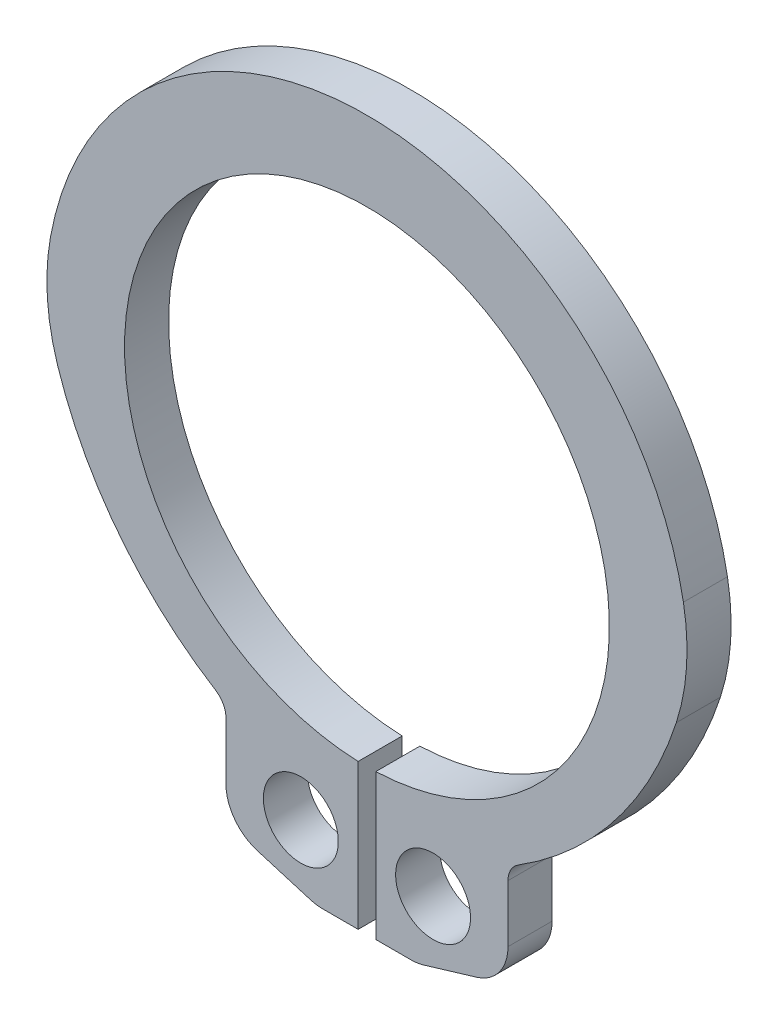
ISO-10303-21;
HEADER;
FILE_DESCRIPTION(('STEP AP214'),'2;1');
FILE_NAME('part.step','',(''),(''),'','','');
FILE_SCHEMA(('AUTOMOTIVE_DESIGN { 1 0 10303 214 1 1 1 1 }'));
ENDSEC;
DATA;
#1=APPLICATION_CONTEXT('core data for automotive mechanical design processes');
#2=APPLICATION_PROTOCOL_DEFINITION('international standard','automotive_design',2000,#1);
#3=PRODUCT_CONTEXT('',#1,'mechanical');
#4=PRODUCT('Part','Part','',(#3));
#5=PRODUCT_RELATED_PRODUCT_CATEGORY('part','',(#4));
#6=PRODUCT_DEFINITION_FORMATION('','',#4);
#7=PRODUCT_DEFINITION_CONTEXT('part definition',#1,'design');
#8=PRODUCT_DEFINITION('design','',#6,#7);
#9=PRODUCT_DEFINITION_SHAPE('','',#8);
#10=(LENGTH_UNIT() NAMED_UNIT(*) SI_UNIT(.MILLI.,.METRE.));
#11=(NAMED_UNIT(*) PLANE_ANGLE_UNIT() SI_UNIT($,.RADIAN.));
#12=(NAMED_UNIT(*) SI_UNIT($,.STERADIAN.) SOLID_ANGLE_UNIT());
#13=UNCERTAINTY_MEASURE_WITH_UNIT(LENGTH_MEASURE(1.E-05),#10,'distance_accuracy_value','');
#14=(GEOMETRIC_REPRESENTATION_CONTEXT(3) GLOBAL_UNCERTAINTY_ASSIGNED_CONTEXT((#13)) GLOBAL_UNIT_ASSIGNED_CONTEXT((#10,
#11,#12)) REPRESENTATION_CONTEXT('',''));
#15=CARTESIAN_POINT('',(0.,0.,0.));
#16=DIRECTION('',(0.,0.,1.));
#17=DIRECTION('',(1.,0.,0.));
#18=AXIS2_PLACEMENT_3D('',#15,#16,#17);
#19=CARTESIAN_POINT('',(2.26199310946051,0.416397853924444,0.499999999999945));
#20=DIRECTION('',(0.,0.,-0.999999999999981));
#21=DIRECTION('',(-1.,0.,0.));
#22=AXIS2_PLACEMENT_3D('',#19,#20,#21);
#23=CYLINDRICAL_SURFACE('',#22,5.);
#24=CARTESIAN_POINT('',(2.26199310946007,0.41639785392622,-0.499999999999945));
#25=DIRECTION('',(0.,0.,-0.999999999999981));
#26=DIRECTION('',(-1.,0.,0.));
#27=AXIS2_PLACEMENT_3D('',#24,#25,#26);
#28=CIRCLE('',#27,5.);
#29=CARTESIAN_POINT('',(7.17936943437547,1.32161057984792,-0.499999999999945));
#30=VERTEX_POINT('',#29);
#31=CARTESIAN_POINT('',(7.01817403919958,-1.12591954647812,-0.499999999999945));
#32=VERTEX_POINT('',#31);
#33=EDGE_CURVE('E208',#30,#32,#28,.T.);
#34=ORIENTED_EDGE('',*,*,#33,.F.);
#35=DIRECTION('',(0.,0.,-0.999999999999981));
#36=VECTOR('',#35,1.);
#37=CARTESIAN_POINT('',(7.17936943437536,1.32161057984836,0.499999999999945));
#38=LINE('',#37,#36);
#39=CARTESIAN_POINT('',(7.17936943437536,1.32161057984836,0.499999999999945));
#40=VERTEX_POINT('',#39);
#41=EDGE_CURVE('E11',#40,#30,#38,.T.);
#42=ORIENTED_EDGE('',*,*,#41,.F.);
#43=CARTESIAN_POINT('',(2.26199310946051,0.416397853924444,0.499999999999945));
#44=DIRECTION('',(0.,0.,-0.999999999999981));
#45=DIRECTION('',(-1.,0.,0.));
#46=AXIS2_PLACEMENT_3D('',#43,#44,#45);
#47=CIRCLE('',#46,5.);
#48=CARTESIAN_POINT('',(7.01817403919958,-1.12591954647812,0.499999999999945));
#49=VERTEX_POINT('',#48);
#50=EDGE_CURVE('E264',#40,#49,#47,.T.);
#51=ORIENTED_EDGE('',*,*,#50,.T.);
#52=DIRECTION('',(0.,0.,-0.999999999999981));
#53=VECTOR('',#52,1.);
#54=CARTESIAN_POINT('',(7.01817403919958,-1.12591954647812,0.499999999999945));
#55=LINE('',#54,#53);
#56=EDGE_CURVE('E45',#49,#32,#55,.T.);
#57=ORIENTED_EDGE('',*,*,#56,.T.);
#58=EDGE_LOOP('',(#34,#42,#51,#57));
#59=FACE_BOUND('',#58,.T.);
#60=ADVANCED_FACE('F39',(#59),#23,.T.);
#61=CARTESIAN_POINT('',(0.,0.,0.499999999999945));
#62=DIRECTION('',(0.,0.,-0.999999999999981));
#63=DIRECTION('',(-1.,0.,0.));
#64=AXIS2_PLACEMENT_3D('',#61,#62,#63);
#65=CYLINDRICAL_SURFACE('',#64,7.29999999999999);
#66=CARTESIAN_POINT('',(0.,0.,-0.499999999999945));
#67=DIRECTION('',(0.,0.,-0.999999999999981));
#68=DIRECTION('',(-1.,0.,0.));
#69=AXIS2_PLACEMENT_3D('',#66,#67,#68);
#70=CIRCLE('',#69,7.29999999999999);
#71=CARTESIAN_POINT('',(-7.17936943437492,1.32161057984792,-0.499999999999945));
#72=VERTEX_POINT('',#71);
#73=EDGE_CURVE('E263',#72,#30,#70,.T.);
#74=ORIENTED_EDGE('',*,*,#73,.F.);
#75=DIRECTION('',(0.,0.,-0.999999999999981));
#76=VECTOR('',#75,1.);
#77=CARTESIAN_POINT('',(-7.1793694343748,1.32161057984836,0.499999999999945));
#78=LINE('',#77,#76);
#79=CARTESIAN_POINT('',(-7.1793694343748,1.32161057984836,0.499999999999945));
#80=VERTEX_POINT('',#79);
#81=EDGE_CURVE('E48',#80,#72,#78,.T.);
#82=ORIENTED_EDGE('',*,*,#81,.F.);
#83=CARTESIAN_POINT('',(0.,0.,0.499999999999945));
#84=DIRECTION('',(0.,0.,-0.999999999999981));
#85=DIRECTION('',(-1.,0.,0.));
#86=AXIS2_PLACEMENT_3D('',#83,#84,#85);
#87=CIRCLE('',#86,7.29999999999999);
#88=EDGE_CURVE('E196',#80,#40,#87,.T.);
#89=ORIENTED_EDGE('',*,*,#88,.T.);
#90=ORIENTED_EDGE('',*,*,#41,.T.);
#91=EDGE_LOOP('',(#74,#82,#89,#90));
#92=FACE_BOUND('',#91,.T.);
#93=ADVANCED_FACE('F301',(#92),#65,.T.);
#94=CARTESIAN_POINT('',(-2.26199310946074,0.416397853924888,0.499999999999945));
#95=DIRECTION('',(0.,0.,-0.999999999999981));
#96=DIRECTION('',(-1.,0.,0.));
#97=AXIS2_PLACEMENT_3D('',#94,#95,#96);
#98=CYLINDRICAL_SURFACE('',#97,5.);
#99=CARTESIAN_POINT('',(-2.26199310946074,0.416397853924888,-0.499999999999945));
#100=DIRECTION('',(0.,0.,-0.999999999999981));
#101=DIRECTION('',(-1.,0.,0.));
#102=AXIS2_PLACEMENT_3D('',#99,#100,#101);
#103=CIRCLE('',#102,5.);
#104=CARTESIAN_POINT('',(-7.01817403919958,-1.12591954647812,-0.499999999999945));
#105=VERTEX_POINT('',#104);
#106=EDGE_CURVE('E183',#105,#72,#103,.T.);
#107=ORIENTED_EDGE('',*,*,#106,.F.);
#108=DIRECTION('',(0.,0.,-0.999999999999981));
#109=VECTOR('',#108,1.);
#110=CARTESIAN_POINT('',(-7.01817403920013,-1.12591954647812,0.499999999999945));
#111=LINE('',#110,#109);
#112=CARTESIAN_POINT('',(-7.01817403920013,-1.12591954647812,0.499999999999945));
#113=VERTEX_POINT('',#112);
#114=EDGE_CURVE('E180',#113,#105,#111,.T.);
#115=ORIENTED_EDGE('',*,*,#114,.F.);
#116=CARTESIAN_POINT('',(-2.26199310946074,0.416397853924888,0.499999999999945));
#117=DIRECTION('',(0.,0.,-0.999999999999981));
#118=DIRECTION('',(-1.,0.,0.));
#119=AXIS2_PLACEMENT_3D('',#116,#117,#118);
#120=CIRCLE('',#119,5.);
#121=EDGE_CURVE('E181',#113,#80,#120,.T.);
#122=ORIENTED_EDGE('',*,*,#121,.T.);
#123=ORIENTED_EDGE('',*,*,#81,.T.);
#124=EDGE_LOOP('',(#107,#115,#122,#123));
#125=FACE_BOUND('',#124,.T.);
#126=ADVANCED_FACE('F185',(#125),#98,.T.);
#127=CARTESIAN_POINT('',(1.06941400291882,1.4966946788677,0.499999999999945));
#128=DIRECTION('',(0.,0.,-0.999999999999981));
#129=DIRECTION('',(-1.,0.,0.));
#130=AXIS2_PLACEMENT_3D('',#127,#128,#129);
#131=CYLINDRICAL_SURFACE('',#130,8.50218711356155);
#132=CARTESIAN_POINT('',(1.06941400291882,1.4966946788677,-0.499999999999945));
#133=DIRECTION('',(0.,0.,-0.999999999999981));
#134=DIRECTION('',(-1.,0.,0.));
#135=AXIS2_PLACEMENT_3D('',#132,#133,#134);
#136=CIRCLE('',#135,8.50218711356155);
#137=CARTESIAN_POINT('',(-3.43509693018251,-5.71416983016171,-0.499999999999945));
#138=VERTEX_POINT('',#137);
#139=EDGE_CURVE('E257',#138,#105,#136,.T.);
#140=ORIENTED_EDGE('',*,*,#139,.F.);
#141=DIRECTION('',(0.,0.,-0.999999999999981));
#142=VECTOR('',#141,1.);
#143=CARTESIAN_POINT('',(-3.43509693018251,-5.71416983016171,0.499999999999945));
#144=LINE('',#143,#142);
#145=CARTESIAN_POINT('',(-3.43509693018251,-5.71416983016171,0.499999999999945));
#146=VERTEX_POINT('',#145);
#147=EDGE_CURVE('E188',#146,#138,#144,.T.);
#148=ORIENTED_EDGE('',*,*,#147,.F.);
#149=CARTESIAN_POINT('',(1.06941400291882,1.4966946788677,0.499999999999945));
#150=DIRECTION('',(0.,0.,-0.999999999999981));
#151=DIRECTION('',(-1.,0.,0.));
#152=AXIS2_PLACEMENT_3D('',#149,#150,#151);
#153=CIRCLE('',#152,8.50218711356155);
#154=EDGE_CURVE('E198',#146,#113,#153,.T.);
#155=ORIENTED_EDGE('',*,*,#154,.T.);
#156=ORIENTED_EDGE('',*,*,#114,.T.);
#157=EDGE_LOOP('',(#140,#148,#155,#156));
#158=FACE_BOUND('',#157,.T.);
#159=ADVANCED_FACE('F199',(#158),#131,.T.);
#160=CARTESIAN_POINT('',(-3.70000000000004,-6.13822921704177,0.499999999999945));
#161=DIRECTION('',(0.,0.,-0.999999999999981));
#162=DIRECTION('',(-1.,0.,0.));
#163=AXIS2_PLACEMENT_3D('',#160,#161,#162);
#164=CYLINDRICAL_SURFACE('',#163,0.499999999999999);
#165=CARTESIAN_POINT('',(-3.70000000000004,-6.13822921704177,-0.499999999999945));
#166=DIRECTION('',(0.,0.,0.999999999999981));
#167=DIRECTION('',(1.,0.,0.));
#168=AXIS2_PLACEMENT_3D('',#165,#166,#167);
#169=CIRCLE('',#168,0.499999999999999);
#170=CARTESIAN_POINT('',(-3.20000000000065,-6.13822921704266,-0.499999999999945));
#171=VERTEX_POINT('',#170);
#172=EDGE_CURVE('E260',#171,#138,#169,.T.);
#173=ORIENTED_EDGE('',*,*,#172,.F.);
#174=DIRECTION('',(0.,0.,-0.999999999999981));
#175=VECTOR('',#174,1.);
#176=CARTESIAN_POINT('',(-3.20000000000065,-6.13822921704266,0.499999999999945));
#177=LINE('',#176,#175);
#178=CARTESIAN_POINT('',(-3.20000000000065,-6.13822921704266,0.499999999999945));
#179=VERTEX_POINT('',#178);
#180=EDGE_CURVE('E267',#179,#171,#177,.T.);
#181=ORIENTED_EDGE('',*,*,#180,.F.);
#182=CARTESIAN_POINT('',(-3.70000000000004,-6.13822921704177,0.499999999999945));
#183=DIRECTION('',(0.,0.,0.999999999999981));
#184=DIRECTION('',(1.,0.,0.));
#185=AXIS2_PLACEMENT_3D('',#182,#183,#184);
#186=CIRCLE('',#185,0.499999999999999);
#187=EDGE_CURVE('E203',#179,#146,#186,.T.);
#188=ORIENTED_EDGE('',*,*,#187,.T.);
#189=ORIENTED_EDGE('',*,*,#147,.T.);
#190=EDGE_LOOP('',(#173,#181,#188,#189));
#191=FACE_BOUND('',#190,.T.);
#192=ADVANCED_FACE('F314',(#191),#164,.F.);
#193=CARTESIAN_POINT('',(-3.2000000000002,-7.43585997502594,0.499999999999945));
#194=DIRECTION('',(-1.,0.,0.));
#195=DIRECTION('',(0.,0.,0.999999999999981));
#196=AXIS2_PLACEMENT_3D('',#193,#194,#195);
#197=PLANE('',#196);
#198=DIRECTION('',(0.,0.999999999999995,0.));
#199=VECTOR('',#198,1.);
#200=CARTESIAN_POINT('',(-3.19999999999965,-7.43585997502461,-0.499999999999945));
#201=LINE('',#200,#199);
#202=CARTESIAN_POINT('',(-3.19999999999965,-7.43585997502461,-0.499999999999945));
#203=VERTEX_POINT('',#202);
#204=EDGE_CURVE('E255',#203,#171,#201,.T.);
#205=ORIENTED_EDGE('',*,*,#204,.F.);
#206=DIRECTION('',(0.,0.,-0.999999999999981));
#207=VECTOR('',#206,1.);
#208=CARTESIAN_POINT('',(-3.2000000000002,-7.43585997502594,0.499999999999945));
#209=LINE('',#208,#207);
#210=CARTESIAN_POINT('',(-3.2000000000002,-7.43585997502594,0.499999999999945));
#211=VERTEX_POINT('',#210);
#212=EDGE_CURVE('E271',#211,#203,#209,.T.);
#213=ORIENTED_EDGE('',*,*,#212,.F.);
#214=DIRECTION('',(0.,0.999999999999995,0.));
#215=VECTOR('',#214,1.);
#216=CARTESIAN_POINT('',(-3.2000000000002,-7.43585997502594,0.499999999999945));
#217=LINE('',#216,#215);
#218=EDGE_CURVE('E201',#211,#179,#217,.T.);
#219=ORIENTED_EDGE('',*,*,#218,.T.);
#220=ORIENTED_EDGE('',*,*,#180,.T.);
#221=EDGE_LOOP('',(#205,#213,#219,#220));
#222=FACE_BOUND('',#221,.T.);
#223=ADVANCED_FACE('F320',(#222),#197,.T.);
#224=CARTESIAN_POINT('',(-2.19999999999987,-7.43585997502416,0.499999999999945));
#225=DIRECTION('',(0.,0.,-0.999999999999981));
#226=DIRECTION('',(-1.,0.,0.));
#227=AXIS2_PLACEMENT_3D('',#224,#225,#226);
#228=CYLINDRICAL_SURFACE('',#227,1.);
#229=CARTESIAN_POINT('',(-2.19999999999987,-7.43585997502416,-0.499999999999945));
#230=DIRECTION('',(0.,0.,-0.999999999999981));
#231=DIRECTION('',(-1.,0.,0.));
#232=AXIS2_PLACEMENT_3D('',#229,#230,#231);
#233=CIRCLE('',#232,1.);
#234=CARTESIAN_POINT('',(-2.48746255165766,-8.39365185293683,-0.499999999999945));
#235=VERTEX_POINT('',#234);
#236=EDGE_CURVE('E253',#235,#203,#233,.T.);
#237=ORIENTED_EDGE('',*,*,#236,.F.);
#238=DIRECTION('',(0.,0.,-0.999999999999981));
#239=VECTOR('',#238,1.);
#240=CARTESIAN_POINT('',(-2.48746255165766,-8.39365185293683,0.499999999999945));
#241=LINE('',#240,#239);
#242=CARTESIAN_POINT('',(-2.48746255165766,-8.39365185293683,0.499999999999945));
#243=VERTEX_POINT('',#242);
#244=EDGE_CURVE('E272',#243,#235,#241,.T.);
#245=ORIENTED_EDGE('',*,*,#244,.F.);
#246=CARTESIAN_POINT('',(-2.19999999999987,-7.43585997502416,0.499999999999945));
#247=DIRECTION('',(0.,0.,-0.999999999999981));
#248=DIRECTION('',(-1.,0.,0.));
#249=AXIS2_PLACEMENT_3D('',#246,#247,#248);
#250=CIRCLE('',#249,1.);
#251=EDGE_CURVE('E450',#243,#211,#250,.T.);
#252=ORIENTED_EDGE('',*,*,#251,.T.);
#253=ORIENTED_EDGE('',*,*,#212,.T.);
#254=EDGE_LOOP('',(#237,#245,#252,#253));
#255=FACE_BOUND('',#254,.T.);
#256=ADVANCED_FACE('F321',(#255),#228,.T.);
#257=CARTESIAN_POINT('',(-1.28631017661229,-8.75415431137583,0.499999999999945));
#258=DIRECTION('',(-0.287462551658082,-0.957791877912019,0.));
#259=DIRECTION('',(0.957791877912025,-0.287462551658072,0.));
#260=AXIS2_PLACEMENT_3D('',#257,#258,#259);
#261=PLANE('',#260);
#262=DIRECTION('',(-0.957791877912019,0.28746255165807,0.));
#263=VECTOR('',#262,1.);
#264=CARTESIAN_POINT('',(-1.28631017661229,-8.75415431137583,-0.499999999999945));
#265=LINE('',#264,#263);
#266=CARTESIAN_POINT('',(-1.28631017661229,-8.75415431137583,-0.499999999999945));
#267=VERTEX_POINT('',#266);
#268=EDGE_CURVE('E249',#267,#235,#265,.T.);
#269=ORIENTED_EDGE('',*,*,#268,.F.);
#270=DIRECTION('',(0.,0.,-0.999999999999981));
#271=VECTOR('',#270,1.);
#272=CARTESIAN_POINT('',(-1.28631017661229,-8.75415431137583,0.499999999999945));
#273=LINE('',#272,#271);
#274=CARTESIAN_POINT('',(-1.28631017661229,-8.75415431137583,0.499999999999945));
#275=VERTEX_POINT('',#274);
#276=EDGE_CURVE('E274',#275,#267,#273,.T.);
#277=ORIENTED_EDGE('',*,*,#276,.F.);
#278=DIRECTION('',(-0.957791877912019,0.28746255165807,0.));
#279=VECTOR('',#278,1.);
#280=CARTESIAN_POINT('',(-1.28631017661229,-8.75415431137583,0.499999999999945));
#281=LINE('',#280,#279);
#282=EDGE_CURVE('E441',#275,#243,#281,.T.);
#283=ORIENTED_EDGE('',*,*,#282,.T.);
#284=ORIENTED_EDGE('',*,*,#244,.T.);
#285=EDGE_LOOP('',(#269,#277,#283,#284));
#286=FACE_BOUND('',#285,.T.);
#287=ADVANCED_FACE('F324',(#286),#261,.T.);
#288=CARTESIAN_POINT('',(-0.998847624954613,-7.79636243346449,0.499999999999945));
#289=DIRECTION('',(0.,0.,-0.999999999999981));
#290=DIRECTION('',(-1.,0.,0.));
#291=AXIS2_PLACEMENT_3D('',#288,#289,#290);
#292=CYLINDRICAL_SURFACE('',#291,1.);
#293=CARTESIAN_POINT('',(-0.998847624955168,-7.79636243346316,-0.499999999999945));
#294=DIRECTION('',(0.,0.,-0.999999999999981));
#295=DIRECTION('',(-1.,0.,0.));
#296=AXIS2_PLACEMENT_3D('',#293,#294,#295);
#297=CIRCLE('',#296,1.);
#298=CARTESIAN_POINT('',(-0.998847624954391,-8.79636243346393,-0.499999999999945));
#299=VERTEX_POINT('',#298);
#300=EDGE_CURVE('E243',#299,#267,#297,.T.);
#301=ORIENTED_EDGE('',*,*,#300,.F.);
#302=DIRECTION('',(0.,0.,-0.999999999999981));
#303=VECTOR('',#302,1.);
#304=CARTESIAN_POINT('',(-0.998847624953947,-8.79636243346482,0.499999999999945));
#305=LINE('',#304,#303);
#306=CARTESIAN_POINT('',(-0.998847624953947,-8.79636243346482,0.499999999999945));
#307=VERTEX_POINT('',#306);
#308=EDGE_CURVE('E280',#307,#299,#305,.T.);
#309=ORIENTED_EDGE('',*,*,#308,.F.);
#310=CARTESIAN_POINT('',(-0.998847624954613,-7.79636243346449,0.499999999999945));
#311=DIRECTION('',(0.,0.,-0.999999999999981));
#312=DIRECTION('',(-1.,0.,0.));
#313=AXIS2_PLACEMENT_3D('',#310,#311,#312);
#314=CIRCLE('',#313,1.);
#315=EDGE_CURVE('E442',#307,#275,#314,.T.);
#316=ORIENTED_EDGE('',*,*,#315,.T.);
#317=ORIENTED_EDGE('',*,*,#276,.T.);
#318=EDGE_LOOP('',(#301,#309,#316,#317));
#319=FACE_BOUND('',#318,.T.);
#320=ADVANCED_FACE('F328',(#319),#292,.T.);
#321=CARTESIAN_POINT('',(-0.200000000000422,-8.79636243346482,0.499999999999945));
#322=DIRECTION('',(0.,-0.999999999999995,0.));
#323=DIRECTION('',(0.,0.,-0.999999999999981));
#324=AXIS2_PLACEMENT_3D('',#321,#322,#323);
#325=PLANE('',#324);
#326=DIRECTION('',(-1.,0.,0.));
#327=VECTOR('',#326,1.);
#328=CARTESIAN_POINT('',(-0.200000000000422,-8.79636243346482,-0.499999999999945));
#329=LINE('',#328,#327);
#330=CARTESIAN_POINT('',(-0.200000000000422,-8.79636243346482,-0.499999999999945));
#331=VERTEX_POINT('',#330);
#332=EDGE_CURVE('E245',#331,#299,#329,.T.);
#333=ORIENTED_EDGE('',*,*,#332,.F.);
#334=DIRECTION('',(0.,0.,-0.999999999999981));
#335=VECTOR('',#334,1.);
#336=CARTESIAN_POINT('',(-0.200000000000422,-8.79636243346482,0.499999999999945));
#337=LINE('',#336,#335);
#338=CARTESIAN_POINT('',(-0.200000000000422,-8.79636243346482,0.499999999999945));
#339=VERTEX_POINT('',#338);
#340=EDGE_CURVE('E276',#339,#331,#337,.T.);
#341=ORIENTED_EDGE('',*,*,#340,.F.);
#342=DIRECTION('',(-1.,0.,0.));
#343=VECTOR('',#342,1.);
#344=CARTESIAN_POINT('',(-0.200000000000422,-8.79636243346482,0.499999999999945));
#345=LINE('',#344,#343);
#346=EDGE_CURVE('E437',#339,#307,#345,.T.);
#347=ORIENTED_EDGE('',*,*,#346,.T.);
#348=ORIENTED_EDGE('',*,*,#308,.T.);
#349=EDGE_LOOP('',(#333,#341,#347,#348));
#350=FACE_BOUND('',#349,.T.);
#351=ADVANCED_FACE('F334',(#350),#325,.T.);
#352=CARTESIAN_POINT('',(-0.200000000000089,-5.49636243346452,0.499999999999945));
#353=DIRECTION('',(1.,0.,0.));
#354=DIRECTION('',(0.,0.,-0.999999999999981));
#355=AXIS2_PLACEMENT_3D('',#352,#353,#354);
#356=PLANE('',#355);
#357=DIRECTION('',(0.,-0.999999999999995,0.));
#358=VECTOR('',#357,1.);
#359=CARTESIAN_POINT('',(-0.200000000000089,-5.49636243346452,-0.499999999999945));
#360=LINE('',#359,#358);
#361=CARTESIAN_POINT('',(-0.200000000000089,-5.49636243346452,-0.499999999999945));
#362=VERTEX_POINT('',#361);
#363=EDGE_CURVE('E239',#362,#331,#360,.T.);
#364=ORIENTED_EDGE('',*,*,#363,.F.);
#365=DIRECTION('',(0.,0.,-0.999999999999981));
#366=VECTOR('',#365,1.);
#367=CARTESIAN_POINT('',(-0.200000000000089,-5.49636243346452,0.499999999999945));
#368=LINE('',#367,#366);
#369=CARTESIAN_POINT('',(-0.200000000000089,-5.49636243346452,0.499999999999945));
#370=VERTEX_POINT('',#369);
#371=EDGE_CURVE('E282',#370,#362,#368,.T.);
#372=ORIENTED_EDGE('',*,*,#371,.F.);
#373=DIRECTION('',(0.,-0.999999999999995,0.));
#374=VECTOR('',#373,1.);
#375=CARTESIAN_POINT('',(-0.200000000000089,-5.49636243346452,0.499999999999945));
#376=LINE('',#375,#374);
#377=EDGE_CURVE('E434',#370,#339,#376,.T.);
#378=ORIENTED_EDGE('',*,*,#377,.T.);
#379=ORIENTED_EDGE('',*,*,#340,.T.);
#380=EDGE_LOOP('',(#364,#372,#378,#379));
#381=FACE_BOUND('',#380,.T.);
#382=ADVANCED_FACE('F340',(#381),#356,.T.);
#383=CARTESIAN_POINT('',(0.,0.,0.499999999999945));
#384=DIRECTION('',(0.,0.,-0.999999999999981));
#385=DIRECTION('',(-1.,0.,0.));
#386=AXIS2_PLACEMENT_3D('',#383,#384,#385);
#387=CYLINDRICAL_SURFACE('',#386,5.5);
#388=CARTESIAN_POINT('',(0.,0.,-0.499999999999945));
#389=DIRECTION('',(0.,0.,0.999999999999981));
#390=DIRECTION('',(1.,0.,0.));
#391=AXIS2_PLACEMENT_3D('',#388,#389,#390);
#392=CIRCLE('',#391,5.5);
#393=CARTESIAN_POINT('',(0.199999999999534,-5.49636243346496,-0.499999999999945));
#394=VERTEX_POINT('',#393);
#395=EDGE_CURVE('E237',#394,#362,#392,.T.);
#396=ORIENTED_EDGE('',*,*,#395,.F.);
#397=DIRECTION('',(0.,0.,-0.999999999999981));
#398=VECTOR('',#397,1.);
#399=CARTESIAN_POINT('',(0.199999999999534,-5.49636243346496,0.499999999999945));
#400=LINE('',#399,#398);
#401=CARTESIAN_POINT('',(0.199999999999534,-5.49636243346496,0.499999999999945));
#402=VERTEX_POINT('',#401);
#403=EDGE_CURVE('E284',#402,#394,#400,.T.);
#404=ORIENTED_EDGE('',*,*,#403,.F.);
#405=CARTESIAN_POINT('',(0.,0.,0.499999999999945));
#406=DIRECTION('',(0.,0.,0.999999999999981));
#407=DIRECTION('',(1.,0.,0.));
#408=AXIS2_PLACEMENT_3D('',#405,#406,#407);
#409=CIRCLE('',#408,5.5);
#410=EDGE_CURVE('E435',#402,#370,#409,.T.);
#411=ORIENTED_EDGE('',*,*,#410,.T.);
#412=ORIENTED_EDGE('',*,*,#371,.T.);
#413=EDGE_LOOP('',(#396,#404,#411,#412));
#414=FACE_BOUND('',#413,.T.);
#415=ADVANCED_FACE('F341',(#414),#387,.F.);
#416=CARTESIAN_POINT('',(0.199999999999867,-8.79636243346393,0.499999999999945));
#417=DIRECTION('',(-1.,0.,0.));
#418=DIRECTION('',(0.,0.,0.999999999999981));
#419=AXIS2_PLACEMENT_3D('',#416,#417,#418);
#420=PLANE('',#419);
#421=DIRECTION('',(0.,0.999999999999995,0.));
#422=VECTOR('',#421,1.);
#423=CARTESIAN_POINT('',(0.199999999999867,-8.79636243346393,-0.499999999999945));
#424=LINE('',#423,#422);
#425=CARTESIAN_POINT('',(0.199999999999867,-8.79636243346393,-0.499999999999945));
#426=VERTEX_POINT('',#425);
#427=EDGE_CURVE('E234',#426,#394,#424,.T.);
#428=ORIENTED_EDGE('',*,*,#427,.F.);
#429=DIRECTION('',(0.,0.,-0.999999999999981));
#430=VECTOR('',#429,1.);
#431=CARTESIAN_POINT('',(0.199999999999867,-8.79636243346393,0.499999999999945));
#432=LINE('',#431,#430);
#433=CARTESIAN_POINT('',(0.199999999999867,-8.79636243346393,0.499999999999945));
#434=VERTEX_POINT('',#433);
#435=EDGE_CURVE('E283',#434,#426,#432,.T.);
#436=ORIENTED_EDGE('',*,*,#435,.F.);
#437=DIRECTION('',(0.,0.999999999999995,0.));
#438=VECTOR('',#437,1.);
#439=CARTESIAN_POINT('',(0.199999999999867,-8.79636243346393,0.499999999999945));
#440=LINE('',#439,#438);
#441=EDGE_CURVE('E427',#434,#402,#440,.T.);
#442=ORIENTED_EDGE('',*,*,#441,.T.);
#443=ORIENTED_EDGE('',*,*,#403,.T.);
#444=EDGE_LOOP('',(#428,#436,#442,#443));
#445=FACE_BOUND('',#444,.T.);
#446=ADVANCED_FACE('F345',(#445),#420,.T.);
#447=CARTESIAN_POINT('',(0.998847624952393,-8.79636243346305,0.499999999999945));
#448=DIRECTION('',(0.,-0.999999999999995,0.));
#449=DIRECTION('',(0.,0.,-0.999999999999981));
#450=AXIS2_PLACEMENT_3D('',#447,#448,#449);
#451=PLANE('',#450);
#452=DIRECTION('',(-1.,0.,0.));
#453=VECTOR('',#452,1.);
#454=CARTESIAN_POINT('',(0.998847624954391,-8.79636243346393,-0.499999999999945));
#455=LINE('',#454,#453);
#456=CARTESIAN_POINT('',(0.998847624954391,-8.79636243346393,-0.499999999999945));
#457=VERTEX_POINT('',#456);
#458=EDGE_CURVE('E228',#457,#426,#455,.T.);
#459=ORIENTED_EDGE('',*,*,#458,.F.);
#460=DIRECTION('',(0.,0.,-0.999999999999981));
#461=VECTOR('',#460,1.);
#462=CARTESIAN_POINT('',(0.998847624952393,-8.79636243346305,0.499999999999945));
#463=LINE('',#462,#461);
#464=CARTESIAN_POINT('',(0.998847624952393,-8.79636243346305,0.499999999999945));
#465=VERTEX_POINT('',#464);
#466=EDGE_CURVE('E287',#465,#457,#463,.T.);
#467=ORIENTED_EDGE('',*,*,#466,.F.);
#468=DIRECTION('',(-1.,0.,0.));
#469=VECTOR('',#468,1.);
#470=CARTESIAN_POINT('',(0.998847624952393,-8.79636243346305,0.499999999999945));
#471=LINE('',#470,#469);
#472=EDGE_CURVE('E426',#465,#434,#471,.T.);
#473=ORIENTED_EDGE('',*,*,#472,.T.);
#474=ORIENTED_EDGE('',*,*,#435,.T.);
#475=EDGE_LOOP('',(#459,#467,#473,#474));
#476=FACE_BOUND('',#475,.T.);
#477=ADVANCED_FACE('F349',(#476),#451,.T.);
#478=CARTESIAN_POINT('',(0.998847624953836,-7.7963624334636,0.499999999999945));
#479=DIRECTION('',(0.,0.,-0.999999999999981));
#480=DIRECTION('',(-1.,0.,0.));
#481=AXIS2_PLACEMENT_3D('',#478,#479,#480);
#482=CYLINDRICAL_SURFACE('',#481,1.);
#483=CARTESIAN_POINT('',(0.998847624953836,-7.7963624334636,-0.499999999999945));
#484=DIRECTION('',(0.,0.,-0.999999999999981));
#485=DIRECTION('',(-1.,0.,0.));
#486=AXIS2_PLACEMENT_3D('',#483,#484,#485);
#487=CIRCLE('',#486,1.);
#488=CARTESIAN_POINT('',(1.28631017661252,-8.75415431137583,-0.499999999999945));
#489=VERTEX_POINT('',#488);
#490=EDGE_CURVE('E230',#489,#457,#487,.T.);
#491=ORIENTED_EDGE('',*,*,#490,.F.);
#492=DIRECTION('',(0.,0.,-0.999999999999981));
#493=VECTOR('',#492,1.);
#494=CARTESIAN_POINT('',(1.28631017661252,-8.75415431137583,0.499999999999945));
#495=LINE('',#494,#493);
#496=CARTESIAN_POINT('',(1.28631017661252,-8.75415431137583,0.499999999999945));
#497=VERTEX_POINT('',#496);
#498=EDGE_CURVE('E288',#497,#489,#495,.T.);
#499=ORIENTED_EDGE('',*,*,#498,.F.);
#500=CARTESIAN_POINT('',(0.998847624953836,-7.7963624334636,0.499999999999945));
#501=DIRECTION('',(0.,0.,-0.999999999999981));
#502=DIRECTION('',(-1.,0.,0.));
#503=AXIS2_PLACEMENT_3D('',#500,#501,#502);
#504=CIRCLE('',#503,1.);
#505=EDGE_CURVE('E421',#497,#465,#504,.T.);
#506=ORIENTED_EDGE('',*,*,#505,.T.);
#507=ORIENTED_EDGE('',*,*,#466,.T.);
#508=EDGE_LOOP('',(#491,#499,#506,#507));
#509=FACE_BOUND('',#508,.T.);
#510=ADVANCED_FACE('F354',(#509),#482,.T.);
#511=CARTESIAN_POINT('',(2.4874625516581,-8.39365185293683,0.499999999999945));
#512=DIRECTION('',(0.287462551658073,-0.957791877912015,0.));
#513=DIRECTION('',(0.957791877912027,0.287462551658079,0.));
#514=AXIS2_PLACEMENT_3D('',#511,#512,#513);
#515=PLANE('',#514);
#516=DIRECTION('',(-0.957791877912027,-0.287462551658079,0.));
#517=VECTOR('',#516,1.);
#518=CARTESIAN_POINT('',(2.4874625516581,-8.39365185293683,-0.499999999999945));
#519=LINE('',#518,#517);
#520=CARTESIAN_POINT('',(2.4874625516581,-8.39365185293683,-0.499999999999945));
#521=VERTEX_POINT('',#520);
#522=EDGE_CURVE('E221',#521,#489,#519,.T.);
#523=ORIENTED_EDGE('',*,*,#522,.F.);
#524=DIRECTION('',(0.,0.,-0.999999999999981));
#525=VECTOR('',#524,1.);
#526=CARTESIAN_POINT('',(2.4874625516581,-8.39365185293683,0.499999999999945));
#527=LINE('',#526,#525);
#528=CARTESIAN_POINT('',(2.4874625516581,-8.39365185293683,0.499999999999945));
#529=VERTEX_POINT('',#528);
#530=EDGE_CURVE('E292',#529,#521,#527,.T.);
#531=ORIENTED_EDGE('',*,*,#530,.F.);
#532=DIRECTION('',(-0.957791877912027,-0.287462551658079,0.));
#533=VECTOR('',#532,1.);
#534=CARTESIAN_POINT('',(2.4874625516581,-8.39365185293683,0.499999999999945));
#535=LINE('',#534,#533);
#536=EDGE_CURVE('E419',#529,#497,#535,.T.);
#537=ORIENTED_EDGE('',*,*,#536,.T.);
#538=ORIENTED_EDGE('',*,*,#498,.T.);
#539=EDGE_LOOP('',(#523,#531,#537,#538));
#540=FACE_BOUND('',#539,.T.);
#541=ADVANCED_FACE('F357',(#540),#515,.T.);
#542=CARTESIAN_POINT('',(2.20000000000053,-7.43585997502549,0.499999999999945));
#543=DIRECTION('',(0.,0.,-0.999999999999981));
#544=DIRECTION('',(-1.,0.,0.));
#545=AXIS2_PLACEMENT_3D('',#542,#543,#544);
#546=CYLINDRICAL_SURFACE('',#545,1.);
#547=CARTESIAN_POINT('',(2.20000000000053,-7.43585997502549,-0.499999999999945));
#548=DIRECTION('',(0.,0.,-0.999999999999981));
#549=DIRECTION('',(-1.,0.,0.));
#550=AXIS2_PLACEMENT_3D('',#547,#548,#549);
#551=CIRCLE('',#550,1.);
#552=CARTESIAN_POINT('',(3.19999999999987,-7.43585997502461,-0.499999999999945));
#553=VERTEX_POINT('',#552);
#554=EDGE_CURVE('E222',#553,#521,#551,.T.);
#555=ORIENTED_EDGE('',*,*,#554,.F.);
#556=DIRECTION('',(0.,0.,-0.999999999999981));
#557=VECTOR('',#556,1.);
#558=CARTESIAN_POINT('',(3.19999999999776,-7.43585997502372,0.499999999999945));
#559=LINE('',#558,#557);
#560=CARTESIAN_POINT('',(3.19999999999776,-7.43585997502372,0.499999999999945));
#561=VERTEX_POINT('',#560);
#562=EDGE_CURVE('E291',#561,#553,#559,.T.);
#563=ORIENTED_EDGE('',*,*,#562,.F.);
#564=CARTESIAN_POINT('',(2.20000000000053,-7.43585997502549,0.499999999999945));
#565=DIRECTION('',(0.,0.,-0.999999999999981));
#566=DIRECTION('',(-1.,0.,0.));
#567=AXIS2_PLACEMENT_3D('',#564,#565,#566);
#568=CIRCLE('',#567,1.);
#569=EDGE_CURVE('E417',#561,#529,#568,.T.);
#570=ORIENTED_EDGE('',*,*,#569,.T.);
#571=ORIENTED_EDGE('',*,*,#530,.T.);
#572=EDGE_LOOP('',(#555,#563,#570,#571));
#573=FACE_BOUND('',#572,.T.);
#574=ADVANCED_FACE('F363',(#573),#546,.T.);
#575=CARTESIAN_POINT('',(3.20000000000087,-6.13822921704177,0.499999999999945));
#576=DIRECTION('',(1.,0.,0.));
#577=DIRECTION('',(0.,0.,-0.999999999999981));
#578=AXIS2_PLACEMENT_3D('',#575,#576,#577);
#579=PLANE('',#578);
#580=DIRECTION('',(0.,-0.999999999999995,0.));
#581=VECTOR('',#580,1.);
#582=CARTESIAN_POINT('',(3.20000000000131,-6.13822921704221,-0.499999999999945));
#583=LINE('',#582,#581);
#584=CARTESIAN_POINT('',(3.20000000000131,-6.13822921704221,-0.499999999999945));
#585=VERTEX_POINT('',#584);
#586=EDGE_CURVE('E217',#585,#553,#583,.T.);
#587=ORIENTED_EDGE('',*,*,#586,.F.);
#588=DIRECTION('',(0.,0.,-0.999999999999981));
#589=VECTOR('',#588,1.);
#590=CARTESIAN_POINT('',(3.20000000000087,-6.13822921704177,0.499999999999945));
#591=LINE('',#590,#589);
#592=CARTESIAN_POINT('',(3.20000000000087,-6.13822921704177,0.499999999999945));
#593=VERTEX_POINT('',#592);
#594=EDGE_CURVE('E293',#593,#585,#591,.T.);
#595=ORIENTED_EDGE('',*,*,#594,.F.);
#596=DIRECTION('',(0.,-0.999999999999995,0.));
#597=VECTOR('',#596,1.);
#598=CARTESIAN_POINT('',(3.20000000000087,-6.13822921704177,0.499999999999945));
#599=LINE('',#598,#597);
#600=EDGE_CURVE('E413',#593,#561,#599,.T.);
#601=ORIENTED_EDGE('',*,*,#600,.T.);
#602=ORIENTED_EDGE('',*,*,#562,.T.);
#603=EDGE_LOOP('',(#587,#595,#601,#602));
#604=FACE_BOUND('',#603,.T.);
#605=ADVANCED_FACE('F364',(#604),#579,.T.);
#606=CARTESIAN_POINT('',(3.69999999999981,-6.13822921704177,0.499999999999945));
#607=DIRECTION('',(0.,0.,-0.999999999999981));
#608=DIRECTION('',(-1.,0.,0.));
#609=AXIS2_PLACEMENT_3D('',#606,#607,#608);
#610=CYLINDRICAL_SURFACE('',#609,0.500000000000001);
#611=CARTESIAN_POINT('',(3.69999999999981,-6.13822921704177,-0.499999999999945));
#612=DIRECTION('',(0.,0.,0.999999999999981));
#613=DIRECTION('',(1.,0.,0.));
#614=AXIS2_PLACEMENT_3D('',#611,#612,#613);
#615=CIRCLE('',#614,0.500000000000001);
#616=CARTESIAN_POINT('',(3.43509693018174,-5.7141698301626,-0.499999999999945));
#617=VERTEX_POINT('',#616);
#618=EDGE_CURVE('E214',#617,#585,#615,.T.);
#619=ORIENTED_EDGE('',*,*,#618,.F.);
#620=DIRECTION('',(0.,0.,-0.999999999999981));
#621=VECTOR('',#620,1.);
#622=CARTESIAN_POINT('',(3.4350969301814,-5.71416983016082,0.499999999999945));
#623=LINE('',#622,#621);
#624=CARTESIAN_POINT('',(3.4350969301814,-5.71416983016082,0.499999999999945));
#625=VERTEX_POINT('',#624);
#626=EDGE_CURVE('E297',#625,#617,#623,.T.);
#627=ORIENTED_EDGE('',*,*,#626,.F.);
#628=CARTESIAN_POINT('',(3.69999999999981,-6.13822921704177,0.499999999999945));
#629=DIRECTION('',(0.,0.,0.999999999999981));
#630=DIRECTION('',(1.,0.,0.));
#631=AXIS2_PLACEMENT_3D('',#628,#629,#630);
#632=CIRCLE('',#631,0.500000000000001);
#633=EDGE_CURVE('E411',#625,#593,#632,.T.);
#634=ORIENTED_EDGE('',*,*,#633,.T.);
#635=ORIENTED_EDGE('',*,*,#594,.T.);
#636=EDGE_LOOP('',(#619,#627,#634,#635));
#637=FACE_BOUND('',#636,.T.);
#638=ADVANCED_FACE('F369',(#637),#610,.F.);
#639=CARTESIAN_POINT('',(-1.06941400291927,1.4966946788677,0.499999999999945));
#640=DIRECTION('',(0.,0.,-0.999999999999981));
#641=DIRECTION('',(-1.,0.,0.));
#642=AXIS2_PLACEMENT_3D('',#639,#640,#641);
#643=CYLINDRICAL_SURFACE('',#642,8.50218711356154);
#644=CARTESIAN_POINT('',(-1.06941400291927,1.4966946788677,-0.499999999999945));
#645=DIRECTION('',(0.,0.,-0.999999999999981));
#646=DIRECTION('',(-1.,0.,0.));
#647=AXIS2_PLACEMENT_3D('',#644,#645,#646);
#648=CIRCLE('',#647,8.50218711356154);
#649=EDGE_CURVE('E211',#32,#617,#648,.T.);
#650=ORIENTED_EDGE('',*,*,#649,.F.);
#651=ORIENTED_EDGE('',*,*,#56,.F.);
#652=CARTESIAN_POINT('',(-1.06941400291927,1.4966946788677,0.499999999999945));
#653=DIRECTION('',(0.,0.,-0.999999999999981));
#654=DIRECTION('',(-1.,0.,0.));
#655=AXIS2_PLACEMENT_3D('',#652,#653,#654);
#656=CIRCLE('',#655,8.50218711356154);
#657=EDGE_CURVE('E406',#49,#625,#656,.T.);
#658=ORIENTED_EDGE('',*,*,#657,.T.);
#659=ORIENTED_EDGE('',*,*,#626,.T.);
#660=EDGE_LOOP('',(#650,#651,#658,#659));
#661=FACE_BOUND('',#660,.T.);
#662=ADVANCED_FACE('F299',(#661),#643,.T.);
#663=CARTESIAN_POINT('',(2.26199310946051,0.416397853924444,0.499999999999945));
#664=DIRECTION('',(0.,0.,-0.999999999999981));
#665=DIRECTION('',(-1.,0.,0.));
#666=AXIS2_PLACEMENT_3D('',#663,#664,#665);
#667=PLANE('',#666);
#668=CARTESIAN_POINT('',(-1.49999999999972,-7.29636243346476,0.499999999999945));
#669=DIRECTION('',(0.,0.,-0.999999999999981));
#670=DIRECTION('',(1.,0.,0.));
#671=AXIS2_PLACEMENT_3D('',#668,#669,#670);
#672=CIRCLE('',#671,0.85);
#673=CARTESIAN_POINT('',(-2.34999999999973,-7.29636243346477,0.499999999999944));
#674=VERTEX_POINT('',#673);
#675=EDGE_CURVE('E396',#674,#674,#672,.T.);
#676=ORIENTED_EDGE('',*,*,#675,.T.);
#677=EDGE_LOOP('',(#676));
#678=FACE_BOUND('',#677,.T.);
#679=CARTESIAN_POINT('',(1.49999999999995,-7.29636243346476,0.499999999999945));
#680=DIRECTION('',(0.,0.,-0.999999999999981));
#681=DIRECTION('',(1.,0.,0.));
#682=AXIS2_PLACEMENT_3D('',#679,#680,#681);
#683=CIRCLE('',#682,0.85);
#684=CARTESIAN_POINT('',(0.649999999999943,-7.29636243346477,0.499999999999944));
#685=VERTEX_POINT('',#684);
#686=EDGE_CURVE('E215',#685,#685,#683,.T.);
#687=ORIENTED_EDGE('',*,*,#686,.T.);
#688=EDGE_LOOP('',(#687));
#689=FACE_BOUND('',#688,.T.);
#690=ORIENTED_EDGE('',*,*,#50,.F.);
#691=ORIENTED_EDGE('',*,*,#88,.F.);
#692=ORIENTED_EDGE('',*,*,#121,.F.);
#693=ORIENTED_EDGE('',*,*,#154,.F.);
#694=ORIENTED_EDGE('',*,*,#187,.F.);
#695=ORIENTED_EDGE('',*,*,#218,.F.);
#696=ORIENTED_EDGE('',*,*,#251,.F.);
#697=ORIENTED_EDGE('',*,*,#282,.F.);
#698=ORIENTED_EDGE('',*,*,#315,.F.);
#699=ORIENTED_EDGE('',*,*,#346,.F.);
#700=ORIENTED_EDGE('',*,*,#377,.F.);
#701=ORIENTED_EDGE('',*,*,#410,.F.);
#702=ORIENTED_EDGE('',*,*,#441,.F.);
#703=ORIENTED_EDGE('',*,*,#472,.F.);
#704=ORIENTED_EDGE('',*,*,#505,.F.);
#705=ORIENTED_EDGE('',*,*,#536,.F.);
#706=ORIENTED_EDGE('',*,*,#569,.F.);
#707=ORIENTED_EDGE('',*,*,#600,.F.);
#708=ORIENTED_EDGE('',*,*,#633,.F.);
#709=ORIENTED_EDGE('',*,*,#657,.F.);
#710=EDGE_LOOP('',(#690,#691,#692,#693,#694,#695,#696,#697,#698,#699,#700,#701,#702,#703,#704,
#705,#706,#707,#708,#709));
#711=FACE_BOUND('',#710,.T.);
#712=ADVANCED_FACE('F193',(#678,#689,#711),#667,.F.);
#713=CARTESIAN_POINT('',(2.26199310946007,0.41639785392622,-0.499999999999945));
#714=DIRECTION('',(0.,0.,-0.999999999999981));
#715=DIRECTION('',(-1.,0.,0.));
#716=AXIS2_PLACEMENT_3D('',#713,#714,#715);
#717=PLANE('',#716);
#718=CARTESIAN_POINT('',(-1.49999999999972,-7.29636243346476,-0.499999999999945));
#719=DIRECTION('',(0.,0.,-0.999999999999981));
#720=DIRECTION('',(1.,0.,0.));
#721=AXIS2_PLACEMENT_3D('',#718,#719,#720);
#722=CIRCLE('',#721,0.85);
#723=CARTESIAN_POINT('',(-2.34999999999973,-7.29636243346477,-0.499999999999946));
#724=VERTEX_POINT('',#723);
#725=EDGE_CURVE('E398',#724,#724,#722,.T.);
#726=ORIENTED_EDGE('',*,*,#725,.F.);
#727=EDGE_LOOP('',(#726));
#728=FACE_BOUND('',#727,.T.);
#729=CARTESIAN_POINT('',(1.49999999999995,-7.29636243346476,-0.499999999999945));
#730=DIRECTION('',(0.,0.,-0.999999999999981));
#731=DIRECTION('',(1.,0.,0.));
#732=AXIS2_PLACEMENT_3D('',#729,#730,#731);
#733=CIRCLE('',#732,0.85);
#734=CARTESIAN_POINT('',(0.649999999999944,-7.29636243346477,-0.499999999999946));
#735=VERTEX_POINT('',#734);
#736=EDGE_CURVE('E402',#735,#735,#733,.T.);
#737=ORIENTED_EDGE('',*,*,#736,.F.);
#738=EDGE_LOOP('',(#737));
#739=FACE_BOUND('',#738,.T.);
#740=ORIENTED_EDGE('',*,*,#33,.T.);
#741=ORIENTED_EDGE('',*,*,#649,.T.);
#742=ORIENTED_EDGE('',*,*,#618,.T.);
#743=ORIENTED_EDGE('',*,*,#586,.T.);
#744=ORIENTED_EDGE('',*,*,#554,.T.);
#745=ORIENTED_EDGE('',*,*,#522,.T.);
#746=ORIENTED_EDGE('',*,*,#490,.T.);
#747=ORIENTED_EDGE('',*,*,#458,.T.);
#748=ORIENTED_EDGE('',*,*,#427,.T.);
#749=ORIENTED_EDGE('',*,*,#395,.T.);
#750=ORIENTED_EDGE('',*,*,#363,.T.);
#751=ORIENTED_EDGE('',*,*,#332,.T.);
#752=ORIENTED_EDGE('',*,*,#300,.T.);
#753=ORIENTED_EDGE('',*,*,#268,.T.);
#754=ORIENTED_EDGE('',*,*,#236,.T.);
#755=ORIENTED_EDGE('',*,*,#204,.T.);
#756=ORIENTED_EDGE('',*,*,#172,.T.);
#757=ORIENTED_EDGE('',*,*,#139,.T.);
#758=ORIENTED_EDGE('',*,*,#106,.T.);
#759=ORIENTED_EDGE('',*,*,#73,.T.);
#760=EDGE_LOOP('',(#740,#741,#742,#743,#744,#745,#746,#747,#748,#749,#750,#751,#752,#753,#754,
#755,#756,#757,#758,#759));
#761=FACE_BOUND('',#760,.T.);
#762=ADVANCED_FACE('F298',(#728,#739,#761),#717,.T.);
#763=CARTESIAN_POINT('',(1.49999999999995,-7.29636243346476,0.499999999999945));
#764=DIRECTION('',(0.,0.,-0.999999999999981));
#765=DIRECTION('',(-1.,0.,0.));
#766=AXIS2_PLACEMENT_3D('',#763,#764,#765);
#767=CYLINDRICAL_SURFACE('',#766,0.85);
#768=CARTESIAN_POINT('',(0.649999999999943,-7.29636243346477,0.499999999999944));
#769=CARTESIAN_POINT('',(0.649999999999943,-7.29636243346477,0.489583333333278));
#770=CARTESIAN_POINT('',(0.649999999999943,-7.29636243346477,0.479166666666613));
#771=CARTESIAN_POINT('',(0.649999999999943,-7.29636243346477,0.458333333333282));
#772=CARTESIAN_POINT('',(0.649999999999943,-7.29636243346477,0.447916666666616));
#773=CARTESIAN_POINT('',(0.649999999999943,-7.29636243346477,0.427083333333285));
#774=CARTESIAN_POINT('',(0.649999999999943,-7.29636243346477,0.41666666666662));
#775=CARTESIAN_POINT('',(0.649999999999943,-7.29636243346477,0.395833333333289));
#776=CARTESIAN_POINT('',(0.649999999999943,-7.29636243346477,0.385416666666623));
#777=CARTESIAN_POINT('',(0.649999999999943,-7.29636243346477,0.364583333333292));
#778=CARTESIAN_POINT('',(0.649999999999943,-7.29636243346477,0.354166666666627));
#779=CARTESIAN_POINT('',(0.649999999999943,-7.29636243346477,0.333333333333296));
#780=CARTESIAN_POINT('',(0.649999999999943,-7.29636243346477,0.32291666666663));
#781=CARTESIAN_POINT('',(0.649999999999943,-7.29636243346477,0.302083333333299));
#782=CARTESIAN_POINT('',(0.649999999999943,-7.29636243346477,0.291666666666633));
#783=CARTESIAN_POINT('',(0.649999999999943,-7.29636243346477,0.270833333333302));
#784=CARTESIAN_POINT('',(0.649999999999943,-7.29636243346477,0.260416666666637));
#785=CARTESIAN_POINT('',(0.649999999999943,-7.29636243346477,0.239583333333306));
#786=CARTESIAN_POINT('',(0.649999999999943,-7.29636243346477,0.22916666666664));
#787=CARTESIAN_POINT('',(0.649999999999943,-7.29636243346477,0.208333333333309));
#788=CARTESIAN_POINT('',(0.649999999999943,-7.29636243346477,0.197916666666644));
#789=CARTESIAN_POINT('',(0.649999999999943,-7.29636243346477,0.177083333333313));
#790=CARTESIAN_POINT('',(0.649999999999943,-7.29636243346477,0.166666666666647));
#791=CARTESIAN_POINT('',(0.649999999999943,-7.29636243346477,0.145833333333316));
#792=CARTESIAN_POINT('',(0.649999999999943,-7.29636243346477,0.135416666666651));
#793=CARTESIAN_POINT('',(0.649999999999943,-7.29636243346477,0.11458333333332));
#794=CARTESIAN_POINT('',(0.649999999999943,-7.29636243346477,0.104166666666654));
#795=CARTESIAN_POINT('',(0.649999999999943,-7.29636243346477,0.0833333333333231));
#796=CARTESIAN_POINT('',(0.649999999999943,-7.29636243346477,0.0729166666666576));
#797=CARTESIAN_POINT('',(0.649999999999943,-7.29636243346477,0.0520833333333266));
#798=CARTESIAN_POINT('',(0.649999999999943,-7.29636243346477,0.0416666666666611));
#799=CARTESIAN_POINT('',(0.649999999999943,-7.29636243346477,0.02083333333333));
#800=CARTESIAN_POINT('',(0.649999999999943,-7.29636243346477,0.0104166666666645));
#801=CARTESIAN_POINT('',(0.649999999999943,-7.29636243346477,-0.0104166666666665));
#802=CARTESIAN_POINT('',(0.649999999999943,-7.29636243346477,-0.020833333333332));
#803=CARTESIAN_POINT('',(0.649999999999943,-7.29636243346477,-0.0416666666666631));
#804=CARTESIAN_POINT('',(0.649999999999943,-7.29636243346477,-0.0520833333333286));
#805=CARTESIAN_POINT('',(0.649999999999943,-7.29636243346477,-0.0729166666666596));
#806=CARTESIAN_POINT('',(0.649999999999943,-7.29636243346477,-0.0833333333333251));
#807=CARTESIAN_POINT('',(0.649999999999943,-7.29636243346477,-0.104166666666656));
#808=CARTESIAN_POINT('',(0.649999999999944,-7.29636243346477,-0.114583333333322));
#809=CARTESIAN_POINT('',(0.649999999999944,-7.29636243346477,-0.135416666666653));
#810=CARTESIAN_POINT('',(0.649999999999944,-7.29636243346477,-0.145833333333318));
#811=CARTESIAN_POINT('',(0.649999999999944,-7.29636243346477,-0.166666666666649));
#812=CARTESIAN_POINT('',(0.649999999999944,-7.29636243346477,-0.177083333333315));
#813=CARTESIAN_POINT('',(0.649999999999944,-7.29636243346477,-0.197916666666646));
#814=CARTESIAN_POINT('',(0.649999999999944,-7.29636243346477,-0.208333333333311));
#815=CARTESIAN_POINT('',(0.649999999999944,-7.29636243346477,-0.229166666666642));
#816=CARTESIAN_POINT('',(0.649999999999944,-7.29636243346477,-0.239583333333308));
#817=CARTESIAN_POINT('',(0.649999999999944,-7.29636243346477,-0.260416666666639));
#818=CARTESIAN_POINT('',(0.649999999999944,-7.29636243346477,-0.270833333333305));
#819=CARTESIAN_POINT('',(0.649999999999944,-7.29636243346477,-0.291666666666636));
#820=CARTESIAN_POINT('',(0.649999999999944,-7.29636243346477,-0.302083333333301));
#821=CARTESIAN_POINT('',(0.649999999999944,-7.29636243346477,-0.322916666666632));
#822=CARTESIAN_POINT('',(0.649999999999944,-7.29636243346477,-0.333333333333298));
#823=CARTESIAN_POINT('',(0.649999999999944,-7.29636243346477,-0.354166666666629));
#824=CARTESIAN_POINT('',(0.649999999999944,-7.29636243346477,-0.364583333333294));
#825=CARTESIAN_POINT('',(0.649999999999944,-7.29636243346477,-0.385416666666625));
#826=CARTESIAN_POINT('',(0.649999999999944,-7.29636243346477,-0.395833333333291));
#827=CARTESIAN_POINT('',(0.649999999999944,-7.29636243346477,-0.416666666666622));
#828=CARTESIAN_POINT('',(0.649999999999944,-7.29636243346477,-0.427083333333287));
#829=CARTESIAN_POINT('',(0.649999999999944,-7.29636243346477,-0.447916666666618));
#830=CARTESIAN_POINT('',(0.649999999999944,-7.29636243346477,-0.458333333333284));
#831=CARTESIAN_POINT('',(0.649999999999944,-7.29636243346477,-0.479166666666615));
#832=CARTESIAN_POINT('',(0.649999999999944,-7.29636243346477,-0.48958333333328));
#833=CARTESIAN_POINT('',(0.649999999999944,-7.29636243346477,-0.499999999999946));
#834=B_SPLINE_CURVE_WITH_KNOTS('',3,(#768,#769,#770,#771,#772,#773,#774,#775,#776,#777,#778,
#779,#780,#781,#782,#783,#784,#785,#786,#787,#788,#789,#790,#791,#792,#793,#794,#795,#796,#797,
#798,#799,#800,#801,#802,#803,#804,#805,#806,#807,#808,#809,#810,#811,#812,#813,#814,#815,#816,
#817,#818,#819,#820,#821,#822,#823,#824,#825,#826,#827,#828,#829,#830,#831,#832,#833),
.UNSPECIFIED.,.F.,.F.,(4,2,2,2,2,2,2,2,2,2,2,2,2,2,2,2,2,2,2,2,2,2,2,2,2,2,2,2,2,2,2,2,4),(0.,
0.0312499999999966,0.0624999999999932,0.0937499999999897,0.124999999999986,0.156249999999983,
0.187499999999979,0.218749999999976,0.249999999999973,0.281249999999969,0.312499999999966,
0.343749999999962,0.374999999999959,0.406249999999955,0.437499999999952,0.468749999999948,
0.499999999999945,0.531249999999941,0.562499999999938,0.593749999999935,0.624999999999931,
0.656249999999928,0.687499999999924,0.718749999999921,0.749999999999917,0.781249999999914,
0.812499999999911,0.843749999999907,0.874999999999904,0.9062499999999,0.937499999999897,
0.968749999999893,0.99999999999989),.UNSPECIFIED.);
#835=EDGE_CURVE('BSEAM381',#685,#735,#834,.T.);
#836=ORIENTED_EDGE('',*,*,#686,.F.);
#837=ORIENTED_EDGE('',*,*,#736,.T.);
#838=ORIENTED_EDGE('',*,*,#835,.T.);
#839=ORIENTED_EDGE('',*,*,#835,.F.);
#840=EDGE_LOOP('',(#836,#838,#837,#839));
#841=FACE_BOUND('',#840,.T.);
#842=ADVANCED_FACE('F381',(#841),#767,.F.);
#843=CARTESIAN_POINT('',(-1.49999999999972,-7.29636243346476,0.499999999999945));
#844=DIRECTION('',(0.,0.,-0.999999999999981));
#845=DIRECTION('',(-1.,0.,0.));
#846=AXIS2_PLACEMENT_3D('',#843,#844,#845);
#847=CYLINDRICAL_SURFACE('',#846,0.85);
#848=CARTESIAN_POINT('',(-2.34999999999973,-7.29636243346477,0.499999999999944));
#849=CARTESIAN_POINT('',(-2.34999999999973,-7.29636243346477,0.489583333333278));
#850=CARTESIAN_POINT('',(-2.34999999999973,-7.29636243346477,0.479166666666613));
#851=CARTESIAN_POINT('',(-2.34999999999973,-7.29636243346477,0.458333333333282));
#852=CARTESIAN_POINT('',(-2.34999999999973,-7.29636243346477,0.447916666666616));
#853=CARTESIAN_POINT('',(-2.34999999999973,-7.29636243346477,0.427083333333285));
#854=CARTESIAN_POINT('',(-2.34999999999973,-7.29636243346477,0.41666666666662));
#855=CARTESIAN_POINT('',(-2.34999999999973,-7.29636243346477,0.395833333333289));
#856=CARTESIAN_POINT('',(-2.34999999999973,-7.29636243346477,0.385416666666623));
#857=CARTESIAN_POINT('',(-2.34999999999973,-7.29636243346477,0.364583333333292));
#858=CARTESIAN_POINT('',(-2.34999999999973,-7.29636243346477,0.354166666666627));
#859=CARTESIAN_POINT('',(-2.34999999999973,-7.29636243346477,0.333333333333296));
#860=CARTESIAN_POINT('',(-2.34999999999973,-7.29636243346477,0.32291666666663));
#861=CARTESIAN_POINT('',(-2.34999999999973,-7.29636243346477,0.302083333333299));
#862=CARTESIAN_POINT('',(-2.34999999999973,-7.29636243346477,0.291666666666633));
#863=CARTESIAN_POINT('',(-2.34999999999973,-7.29636243346477,0.270833333333302));
#864=CARTESIAN_POINT('',(-2.34999999999973,-7.29636243346477,0.260416666666637));
#865=CARTESIAN_POINT('',(-2.34999999999973,-7.29636243346477,0.239583333333306));
#866=CARTESIAN_POINT('',(-2.34999999999973,-7.29636243346477,0.22916666666664));
#867=CARTESIAN_POINT('',(-2.34999999999973,-7.29636243346477,0.208333333333309));
#868=CARTESIAN_POINT('',(-2.34999999999973,-7.29636243346477,0.197916666666644));
#869=CARTESIAN_POINT('',(-2.34999999999973,-7.29636243346477,0.177083333333313));
#870=CARTESIAN_POINT('',(-2.34999999999973,-7.29636243346477,0.166666666666647));
#871=CARTESIAN_POINT('',(-2.34999999999973,-7.29636243346477,0.145833333333316));
#872=CARTESIAN_POINT('',(-2.34999999999973,-7.29636243346477,0.135416666666651));
#873=CARTESIAN_POINT('',(-2.34999999999973,-7.29636243346477,0.11458333333332));
#874=CARTESIAN_POINT('',(-2.34999999999973,-7.29636243346477,0.104166666666654));
#875=CARTESIAN_POINT('',(-2.34999999999973,-7.29636243346477,0.0833333333333231));
#876=CARTESIAN_POINT('',(-2.34999999999973,-7.29636243346477,0.0729166666666576));
#877=CARTESIAN_POINT('',(-2.34999999999973,-7.29636243346477,0.0520833333333266));
#878=CARTESIAN_POINT('',(-2.34999999999973,-7.29636243346477,0.0416666666666611));
#879=CARTESIAN_POINT('',(-2.34999999999973,-7.29636243346477,0.02083333333333));
#880=CARTESIAN_POINT('',(-2.34999999999973,-7.29636243346477,0.0104166666666645));
#881=CARTESIAN_POINT('',(-2.34999999999973,-7.29636243346477,-0.0104166666666665));
#882=CARTESIAN_POINT('',(-2.34999999999973,-7.29636243346477,-0.020833333333332));
#883=CARTESIAN_POINT('',(-2.34999999999973,-7.29636243346477,-0.0416666666666631));
#884=CARTESIAN_POINT('',(-2.34999999999973,-7.29636243346477,-0.0520833333333286));
#885=CARTESIAN_POINT('',(-2.34999999999973,-7.29636243346477,-0.0729166666666596));
#886=CARTESIAN_POINT('',(-2.34999999999973,-7.29636243346477,-0.0833333333333251));
#887=CARTESIAN_POINT('',(-2.34999999999973,-7.29636243346477,-0.104166666666656));
#888=CARTESIAN_POINT('',(-2.34999999999973,-7.29636243346477,-0.114583333333322));
#889=CARTESIAN_POINT('',(-2.34999999999973,-7.29636243346477,-0.135416666666653));
#890=CARTESIAN_POINT('',(-2.34999999999973,-7.29636243346477,-0.145833333333318));
#891=CARTESIAN_POINT('',(-2.34999999999973,-7.29636243346477,-0.166666666666649));
#892=CARTESIAN_POINT('',(-2.34999999999973,-7.29636243346477,-0.177083333333315));
#893=CARTESIAN_POINT('',(-2.34999999999973,-7.29636243346477,-0.197916666666646));
#894=CARTESIAN_POINT('',(-2.34999999999973,-7.29636243346477,-0.208333333333311));
#895=CARTESIAN_POINT('',(-2.34999999999973,-7.29636243346477,-0.229166666666642));
#896=CARTESIAN_POINT('',(-2.34999999999973,-7.29636243346477,-0.239583333333308));
#897=CARTESIAN_POINT('',(-2.34999999999973,-7.29636243346477,-0.260416666666639));
#898=CARTESIAN_POINT('',(-2.34999999999973,-7.29636243346477,-0.270833333333305));
#899=CARTESIAN_POINT('',(-2.34999999999973,-7.29636243346477,-0.291666666666636));
#900=CARTESIAN_POINT('',(-2.34999999999973,-7.29636243346477,-0.302083333333301));
#901=CARTESIAN_POINT('',(-2.34999999999973,-7.29636243346477,-0.322916666666632));
#902=CARTESIAN_POINT('',(-2.34999999999973,-7.29636243346477,-0.333333333333298));
#903=CARTESIAN_POINT('',(-2.34999999999973,-7.29636243346477,-0.354166666666629));
#904=CARTESIAN_POINT('',(-2.34999999999973,-7.29636243346477,-0.364583333333294));
#905=CARTESIAN_POINT('',(-2.34999999999973,-7.29636243346477,-0.385416666666625));
#906=CARTESIAN_POINT('',(-2.34999999999973,-7.29636243346477,-0.395833333333291));
#907=CARTESIAN_POINT('',(-2.34999999999973,-7.29636243346477,-0.416666666666622));
#908=CARTESIAN_POINT('',(-2.34999999999973,-7.29636243346477,-0.427083333333287));
#909=CARTESIAN_POINT('',(-2.34999999999973,-7.29636243346477,-0.447916666666618));
#910=CARTESIAN_POINT('',(-2.34999999999973,-7.29636243346477,-0.458333333333284));
#911=CARTESIAN_POINT('',(-2.34999999999973,-7.29636243346477,-0.479166666666615));
#912=CARTESIAN_POINT('',(-2.34999999999973,-7.29636243346477,-0.48958333333328));
#913=CARTESIAN_POINT('',(-2.34999999999973,-7.29636243346477,-0.499999999999946));
#914=B_SPLINE_CURVE_WITH_KNOTS('',3,(#848,#849,#850,#851,#852,#853,#854,#855,#856,#857,#858,
#859,#860,#861,#862,#863,#864,#865,#866,#867,#868,#869,#870,#871,#872,#873,#874,#875,#876,#877,
#878,#879,#880,#881,#882,#883,#884,#885,#886,#887,#888,#889,#890,#891,#892,#893,#894,#895,#896,
#897,#898,#899,#900,#901,#902,#903,#904,#905,#906,#907,#908,#909,#910,#911,#912,#913),
.UNSPECIFIED.,.F.,.F.,(4,2,2,2,2,2,2,2,2,2,2,2,2,2,2,2,2,2,2,2,2,2,2,2,2,2,2,2,2,2,2,2,4),(0.,
0.0312499999999966,0.0624999999999932,0.0937499999999897,0.124999999999986,0.156249999999983,
0.187499999999979,0.218749999999976,0.249999999999973,0.281249999999969,0.312499999999966,
0.343749999999962,0.374999999999959,0.406249999999955,0.437499999999952,0.468749999999948,
0.499999999999945,0.531249999999941,0.562499999999938,0.593749999999935,0.624999999999931,
0.656249999999928,0.687499999999924,0.718749999999921,0.749999999999917,0.781249999999914,
0.812499999999911,0.843749999999907,0.874999999999904,0.9062499999999,0.937499999999897,
0.968749999999893,0.99999999999989),.UNSPECIFIED.);
#915=EDGE_CURVE('BSEAM389',#674,#724,#914,.T.);
#916=ORIENTED_EDGE('',*,*,#675,.F.);
#917=ORIENTED_EDGE('',*,*,#725,.T.);
#918=ORIENTED_EDGE('',*,*,#915,.T.);
#919=ORIENTED_EDGE('',*,*,#915,.F.);
#920=EDGE_LOOP('',(#916,#918,#917,#919));
#921=FACE_BOUND('',#920,.T.);
#922=ADVANCED_FACE('F389',(#921),#847,.F.);
#923=CLOSED_SHELL('',(#60,#93,#126,#159,#192,#223,#256,#287,#320,#351,#382,#415,#446,#477,#510,
#541,#574,#605,#638,#662,#712,#762,#842,#922));
#924=MANIFOLD_SOLID_BREP('B2',#923);
#925=ADVANCED_BREP_SHAPE_REPRESENTATION('',(#18,#924),#14);
#926=SHAPE_DEFINITION_REPRESENTATION(#9,#925);
ENDSEC;
END-ISO-10303-21;
